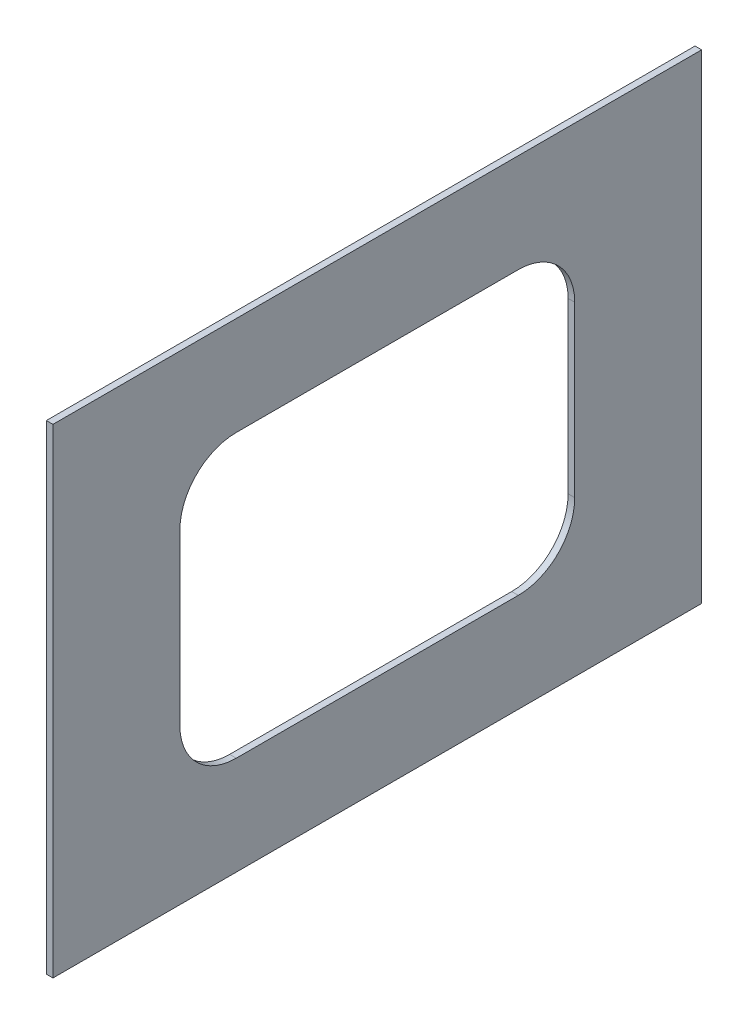
ISO-10303-21;
HEADER;
FILE_DESCRIPTION(('STEP AP214'),'2;1');
FILE_NAME('part.step','',(''),(''),'','','');
FILE_SCHEMA(('AUTOMOTIVE_DESIGN { 1 0 10303 214 1 1 1 1 }'));
ENDSEC;
DATA;
#1=APPLICATION_CONTEXT('core data for automotive mechanical design processes');
#2=APPLICATION_PROTOCOL_DEFINITION('international standard','automotive_design',2000,#1);
#3=PRODUCT_CONTEXT('',#1,'mechanical');
#4=PRODUCT('Part','Part','',(#3));
#5=PRODUCT_RELATED_PRODUCT_CATEGORY('part','',(#4));
#6=PRODUCT_DEFINITION_FORMATION('','',#4);
#7=PRODUCT_DEFINITION_CONTEXT('part definition',#1,'design');
#8=PRODUCT_DEFINITION('design','',#6,#7);
#9=PRODUCT_DEFINITION_SHAPE('','',#8);
#10=(LENGTH_UNIT() NAMED_UNIT(*) SI_UNIT(.MILLI.,.METRE.));
#11=(NAMED_UNIT(*) PLANE_ANGLE_UNIT() SI_UNIT($,.RADIAN.));
#12=(NAMED_UNIT(*) SI_UNIT($,.STERADIAN.) SOLID_ANGLE_UNIT());
#13=UNCERTAINTY_MEASURE_WITH_UNIT(LENGTH_MEASURE(1.E-05),#10,'distance_accuracy_value','');
#14=(GEOMETRIC_REPRESENTATION_CONTEXT(3) GLOBAL_UNCERTAINTY_ASSIGNED_CONTEXT((#13)) GLOBAL_UNIT_ASSIGNED_CONTEXT((#10,
#11,#12)) REPRESENTATION_CONTEXT('',''));
#15=CARTESIAN_POINT('',(0.,0.,0.));
#16=DIRECTION('',(0.,0.,1.));
#17=DIRECTION('',(1.,0.,0.));
#18=AXIS2_PLACEMENT_3D('',#15,#16,#17);
#19=CARTESIAN_POINT('',(11.90625,0.,0.));
#20=DIRECTION('',(-1.,0.,0.));
#21=DIRECTION('',(0.,0.,1.));
#22=AXIS2_PLACEMENT_3D('',#19,#20,#21);
#23=PLANE('',#22);
#24=DIRECTION('',(0.,-1.,0.));
#25=VECTOR('',#24,1.);
#26=CARTESIAN_POINT('',(11.90625,0.,0.));
#27=LINE('',#26,#25);
#28=CARTESIAN_POINT('',(11.90625,863.6,0.));
#29=VERTEX_POINT('',#28);
#30=CARTESIAN_POINT('',(11.90625,0.,0.));
#31=VERTEX_POINT('',#30);
#32=EDGE_CURVE('E218',#29,#31,#27,.T.);
#33=ORIENTED_EDGE('',*,*,#32,.T.);
#34=DIRECTION('',(0.,0.,-1.));
#35=VECTOR('',#34,1.);
#36=CARTESIAN_POINT('',(11.90625,0.,0.));
#37=LINE('',#36,#35);
#38=CARTESIAN_POINT('',(11.90625,0.,-1168.4));
#39=VERTEX_POINT('',#38);
#40=EDGE_CURVE('E222',#31,#39,#37,.T.);
#41=ORIENTED_EDGE('',*,*,#40,.T.);
#42=DIRECTION('',(0.,1.,0.));
#43=VECTOR('',#42,1.);
#44=CARTESIAN_POINT('',(11.90625,0.,-1168.4));
#45=LINE('',#44,#43);
#46=CARTESIAN_POINT('',(11.90625,863.6,-1168.4));
#47=VERTEX_POINT('',#46);
#48=EDGE_CURVE('E226',#39,#47,#45,.T.);
#49=ORIENTED_EDGE('',*,*,#48,.T.);
#50=DIRECTION('',(0.,0.,1.));
#51=VECTOR('',#50,1.);
#52=CARTESIAN_POINT('',(11.90625,863.6,0.));
#53=LINE('',#52,#51);
#54=EDGE_CURVE('E229',#47,#29,#53,.T.);
#55=ORIENTED_EDGE('',*,*,#54,.T.);
#56=EDGE_LOOP('',(#33,#41,#49,#55));
#57=FACE_BOUND('',#56,.T.);
#58=CARTESIAN_POINT('',(11.90625,279.4,-330.2));
#59=DIRECTION('',(1.,0.,0.));
#60=DIRECTION('',(0.,0.,-1.));
#61=AXIS2_PLACEMENT_3D('',#58,#59,#60);
#62=CIRCLE('',#61,101.6);
#63=CARTESIAN_POINT('',(11.90625,279.4,-228.6));
#64=VERTEX_POINT('',#63);
#65=CARTESIAN_POINT('',(11.90625,177.8,-330.2));
#66=VERTEX_POINT('',#65);
#67=EDGE_CURVE('E128',#64,#66,#62,.T.);
#68=ORIENTED_EDGE('',*,*,#67,.F.);
#69=DIRECTION('',(0.,-1.,0.));
#70=VECTOR('',#69,1.);
#71=CARTESIAN_POINT('',(11.90625,584.2,-228.6));
#72=LINE('',#71,#70);
#73=CARTESIAN_POINT('',(11.90625,584.2,-228.6));
#74=VERTEX_POINT('',#73);
#75=EDGE_CURVE('E170',#74,#64,#72,.T.);
#76=ORIENTED_EDGE('',*,*,#75,.F.);
#77=CARTESIAN_POINT('',(11.90625,584.2,-330.2));
#78=DIRECTION('',(1.,0.,0.));
#79=DIRECTION('',(0.,0.,-1.));
#80=AXIS2_PLACEMENT_3D('',#77,#78,#79);
#81=CIRCLE('',#80,101.6);
#82=CARTESIAN_POINT('',(11.90625,685.8,-330.2));
#83=VERTEX_POINT('',#82);
#84=EDGE_CURVE('E167',#83,#74,#81,.T.);
#85=ORIENTED_EDGE('',*,*,#84,.F.);
#86=DIRECTION('',(0.,0.,1.));
#87=VECTOR('',#86,1.);
#88=CARTESIAN_POINT('',(11.90625,685.8,-330.2));
#89=LINE('',#88,#87);
#90=CARTESIAN_POINT('',(11.90625,685.8,-838.2));
#91=VERTEX_POINT('',#90);
#92=EDGE_CURVE('E164',#91,#83,#89,.T.);
#93=ORIENTED_EDGE('',*,*,#92,.F.);
#94=CARTESIAN_POINT('',(11.90625,584.2,-838.2));
#95=DIRECTION('',(1.,0.,0.));
#96=DIRECTION('',(0.,0.,1.));
#97=AXIS2_PLACEMENT_3D('',#94,#95,#96);
#98=CIRCLE('',#97,101.6);
#99=CARTESIAN_POINT('',(11.90625,584.2,-939.8));
#100=VERTEX_POINT('',#99);
#101=EDGE_CURVE('E161',#100,#91,#98,.T.);
#102=ORIENTED_EDGE('',*,*,#101,.F.);
#103=DIRECTION('',(0.,1.,0.));
#104=VECTOR('',#103,1.);
#105=CARTESIAN_POINT('',(11.90625,584.2,-939.8));
#106=LINE('',#105,#104);
#107=CARTESIAN_POINT('',(11.90625,279.4,-939.8));
#108=VERTEX_POINT('',#107);
#109=EDGE_CURVE('E156',#108,#100,#106,.T.);
#110=ORIENTED_EDGE('',*,*,#109,.F.);
#111=CARTESIAN_POINT('',(11.90625,279.4,-838.2));
#112=DIRECTION('',(1.,0.,0.));
#113=DIRECTION('',(0.,0.,-1.));
#114=AXIS2_PLACEMENT_3D('',#111,#112,#113);
#115=CIRCLE('',#114,101.6);
#116=CARTESIAN_POINT('',(11.90625,177.8,-838.2));
#117=VERTEX_POINT('',#116);
#118=EDGE_CURVE('E151',#117,#108,#115,.T.);
#119=ORIENTED_EDGE('',*,*,#118,.F.);
#120=DIRECTION('',(0.,0.,-1.));
#121=VECTOR('',#120,1.);
#122=CARTESIAN_POINT('',(11.90625,177.8,-330.2));
#123=LINE('',#122,#121);
#124=EDGE_CURVE('E137',#66,#117,#123,.T.);
#125=ORIENTED_EDGE('',*,*,#124,.F.);
#126=EDGE_LOOP('',(#68,#76,#85,#93,#102,#110,#119,#125));
#127=FACE_BOUND('',#126,.T.);
#128=ADVANCED_FACE('F38',(#57,#127),#23,.F.);
#129=CARTESIAN_POINT('',(0.,0.,0.));
#130=DIRECTION('',(-1.,0.,0.));
#131=DIRECTION('',(0.,0.,1.));
#132=AXIS2_PLACEMENT_3D('',#129,#130,#131);
#133=PLANE('',#132);
#134=DIRECTION('',(0.,-1.,0.));
#135=VECTOR('',#134,1.);
#136=CARTESIAN_POINT('',(0.,0.,0.));
#137=LINE('',#136,#135);
#138=CARTESIAN_POINT('',(0.,863.6,0.));
#139=VERTEX_POINT('',#138);
#140=CARTESIAN_POINT('',(0.,0.,0.));
#141=VERTEX_POINT('',#140);
#142=EDGE_CURVE('E146',#139,#141,#137,.T.);
#143=ORIENTED_EDGE('',*,*,#142,.F.);
#144=DIRECTION('',(0.,0.,1.));
#145=VECTOR('',#144,1.);
#146=CARTESIAN_POINT('',(0.,863.6,0.));
#147=LINE('',#146,#145);
#148=CARTESIAN_POINT('',(0.,863.6,-1168.4));
#149=VERTEX_POINT('',#148);
#150=EDGE_CURVE('E223',#149,#139,#147,.T.);
#151=ORIENTED_EDGE('',*,*,#150,.F.);
#152=DIRECTION('',(0.,1.,0.));
#153=VECTOR('',#152,1.);
#154=CARTESIAN_POINT('',(0.,0.,-1168.4));
#155=LINE('',#154,#153);
#156=CARTESIAN_POINT('',(0.,0.,-1168.4));
#157=VERTEX_POINT('',#156);
#158=EDGE_CURVE('E239',#157,#149,#155,.T.);
#159=ORIENTED_EDGE('',*,*,#158,.F.);
#160=DIRECTION('',(0.,0.,-1.));
#161=VECTOR('',#160,1.);
#162=CARTESIAN_POINT('',(0.,0.,0.));
#163=LINE('',#162,#161);
#164=EDGE_CURVE('E236',#141,#157,#163,.T.);
#165=ORIENTED_EDGE('',*,*,#164,.F.);
#166=EDGE_LOOP('',(#143,#151,#159,#165));
#167=FACE_BOUND('',#166,.T.);
#168=DIRECTION('',(0.,-1.,0.));
#169=VECTOR('',#168,1.);
#170=CARTESIAN_POINT('',(0.,584.2,-228.6));
#171=LINE('',#170,#169);
#172=CARTESIAN_POINT('',(0.,584.2,-228.6));
#173=VERTEX_POINT('',#172);
#174=CARTESIAN_POINT('',(0.,279.4,-228.6));
#175=VERTEX_POINT('',#174);
#176=EDGE_CURVE('E138',#173,#175,#171,.T.);
#177=ORIENTED_EDGE('',*,*,#176,.T.);
#178=CARTESIAN_POINT('',(0.,279.4,-330.2));
#179=DIRECTION('',(1.,0.,0.));
#180=DIRECTION('',(0.,0.,-1.));
#181=AXIS2_PLACEMENT_3D('',#178,#179,#180);
#182=CIRCLE('',#181,101.6);
#183=CARTESIAN_POINT('',(0.,177.8,-330.2));
#184=VERTEX_POINT('',#183);
#185=EDGE_CURVE('E62',#175,#184,#182,.T.);
#186=ORIENTED_EDGE('',*,*,#185,.T.);
#187=DIRECTION('',(0.,0.,-1.));
#188=VECTOR('',#187,1.);
#189=CARTESIAN_POINT('',(0.,177.8,-330.2));
#190=LINE('',#189,#188);
#191=CARTESIAN_POINT('',(0.,177.8,-838.2));
#192=VERTEX_POINT('',#191);
#193=EDGE_CURVE('E144',#184,#192,#190,.T.);
#194=ORIENTED_EDGE('',*,*,#193,.T.);
#195=CARTESIAN_POINT('',(0.,279.4,-838.2));
#196=DIRECTION('',(1.,0.,0.));
#197=DIRECTION('',(0.,0.,-1.));
#198=AXIS2_PLACEMENT_3D('',#195,#196,#197);
#199=CIRCLE('',#198,101.6);
#200=CARTESIAN_POINT('',(0.,279.4,-939.8));
#201=VERTEX_POINT('',#200);
#202=EDGE_CURVE('E177',#192,#201,#199,.T.);
#203=ORIENTED_EDGE('',*,*,#202,.T.);
#204=DIRECTION('',(0.,1.,0.));
#205=VECTOR('',#204,1.);
#206=CARTESIAN_POINT('',(0.,584.2,-939.8));
#207=LINE('',#206,#205);
#208=CARTESIAN_POINT('',(0.,584.2,-939.8));
#209=VERTEX_POINT('',#208);
#210=EDGE_CURVE('E181',#201,#209,#207,.T.);
#211=ORIENTED_EDGE('',*,*,#210,.T.);
#212=CARTESIAN_POINT('',(0.,584.2,-838.2));
#213=DIRECTION('',(1.,0.,0.));
#214=DIRECTION('',(0.,0.,1.));
#215=AXIS2_PLACEMENT_3D('',#212,#213,#214);
#216=CIRCLE('',#215,101.6);
#217=CARTESIAN_POINT('',(0.,685.8,-838.2));
#218=VERTEX_POINT('',#217);
#219=EDGE_CURVE('E185',#209,#218,#216,.T.);
#220=ORIENTED_EDGE('',*,*,#219,.T.);
#221=DIRECTION('',(0.,0.,1.));
#222=VECTOR('',#221,1.);
#223=CARTESIAN_POINT('',(0.,685.8,-330.2));
#224=LINE('',#223,#222);
#225=CARTESIAN_POINT('',(0.,685.8,-330.2));
#226=VERTEX_POINT('',#225);
#227=EDGE_CURVE('E189',#218,#226,#224,.T.);
#228=ORIENTED_EDGE('',*,*,#227,.T.);
#229=CARTESIAN_POINT('',(0.,584.2,-330.2));
#230=DIRECTION('',(1.,0.,0.));
#231=DIRECTION('',(0.,0.,-1.));
#232=AXIS2_PLACEMENT_3D('',#229,#230,#231);
#233=CIRCLE('',#232,101.6);
#234=EDGE_CURVE('E193',#226,#173,#233,.T.);
#235=ORIENTED_EDGE('',*,*,#234,.T.);
#236=EDGE_LOOP('',(#177,#186,#194,#203,#211,#220,#228,#235));
#237=FACE_BOUND('',#236,.T.);
#238=ADVANCED_FACE('F263',(#167,#237),#133,.T.);
#239=CARTESIAN_POINT('',(11.90625,0.,0.));
#240=DIRECTION('',(0.,0.,-1.));
#241=DIRECTION('',(-1.,0.,0.));
#242=AXIS2_PLACEMENT_3D('',#239,#240,#241);
#243=PLANE('',#242);
#244=ORIENTED_EDGE('',*,*,#142,.T.);
#245=DIRECTION('',(-1.,0.,0.));
#246=VECTOR('',#245,1.);
#247=CARTESIAN_POINT('',(11.90625,0.,0.));
#248=LINE('',#247,#246);
#249=EDGE_CURVE('E11',#31,#141,#248,.T.);
#250=ORIENTED_EDGE('',*,*,#249,.F.);
#251=ORIENTED_EDGE('',*,*,#32,.F.);
#252=DIRECTION('',(-1.,0.,0.));
#253=VECTOR('',#252,1.);
#254=CARTESIAN_POINT('',(11.90625,863.6,0.));
#255=LINE('',#254,#253);
#256=EDGE_CURVE('E232',#29,#139,#255,.T.);
#257=ORIENTED_EDGE('',*,*,#256,.T.);
#258=EDGE_LOOP('',(#244,#250,#251,#257));
#259=FACE_BOUND('',#258,.T.);
#260=ADVANCED_FACE('F40',(#259),#243,.F.);
#261=CARTESIAN_POINT('',(11.90625,0.,0.));
#262=DIRECTION('',(0.,1.,0.));
#263=DIRECTION('',(0.,0.,1.));
#264=AXIS2_PLACEMENT_3D('',#261,#262,#263);
#265=PLANE('',#264);
#266=ORIENTED_EDGE('',*,*,#164,.T.);
#267=DIRECTION('',(-1.,0.,0.));
#268=VECTOR('',#267,1.);
#269=CARTESIAN_POINT('',(11.90625,0.,-1168.4));
#270=LINE('',#269,#268);
#271=EDGE_CURVE('E47',#39,#157,#270,.T.);
#272=ORIENTED_EDGE('',*,*,#271,.F.);
#273=ORIENTED_EDGE('',*,*,#40,.F.);
#274=ORIENTED_EDGE('',*,*,#249,.T.);
#275=EDGE_LOOP('',(#266,#272,#273,#274));
#276=FACE_BOUND('',#275,.T.);
#277=ADVANCED_FACE('F273',(#276),#265,.F.);
#278=CARTESIAN_POINT('',(11.90625,0.,-1168.4));
#279=DIRECTION('',(0.,0.,1.));
#280=DIRECTION('',(1.,0.,0.));
#281=AXIS2_PLACEMENT_3D('',#278,#279,#280);
#282=PLANE('',#281);
#283=ORIENTED_EDGE('',*,*,#158,.T.);
#284=DIRECTION('',(-1.,0.,0.));
#285=VECTOR('',#284,1.);
#286=CARTESIAN_POINT('',(11.90625,863.6,-1168.4));
#287=LINE('',#286,#285);
#288=EDGE_CURVE('E247',#47,#149,#287,.T.);
#289=ORIENTED_EDGE('',*,*,#288,.F.);
#290=ORIENTED_EDGE('',*,*,#48,.F.);
#291=ORIENTED_EDGE('',*,*,#271,.T.);
#292=EDGE_LOOP('',(#283,#289,#290,#291));
#293=FACE_BOUND('',#292,.T.);
#294=ADVANCED_FACE('F257',(#293),#282,.F.);
#295=CARTESIAN_POINT('',(11.90625,863.6,0.));
#296=DIRECTION('',(0.,-1.,0.));
#297=DIRECTION('',(0.,0.,-1.));
#298=AXIS2_PLACEMENT_3D('',#295,#296,#297);
#299=PLANE('',#298);
#300=ORIENTED_EDGE('',*,*,#150,.T.);
#301=ORIENTED_EDGE('',*,*,#256,.F.);
#302=ORIENTED_EDGE('',*,*,#54,.F.);
#303=ORIENTED_EDGE('',*,*,#288,.T.);
#304=EDGE_LOOP('',(#300,#301,#302,#303));
#305=FACE_BOUND('',#304,.T.);
#306=ADVANCED_FACE('F267',(#305),#299,.F.);
#307=CARTESIAN_POINT('',(11.90625,279.4,-330.2));
#308=DIRECTION('',(-1.,0.,0.));
#309=DIRECTION('',(0.,0.,1.));
#310=AXIS2_PLACEMENT_3D('',#307,#308,#309);
#311=CYLINDRICAL_SURFACE('',#310,101.6);
#312=ORIENTED_EDGE('',*,*,#185,.F.);
#313=DIRECTION('',(-1.,0.,0.));
#314=VECTOR('',#313,1.);
#315=CARTESIAN_POINT('',(11.90625,279.4,-228.6));
#316=LINE('',#315,#314);
#317=EDGE_CURVE('E132',#64,#175,#316,.T.);
#318=ORIENTED_EDGE('',*,*,#317,.F.);
#319=ORIENTED_EDGE('',*,*,#67,.T.);
#320=DIRECTION('',(-1.,0.,0.));
#321=VECTOR('',#320,1.);
#322=CARTESIAN_POINT('',(11.90625,177.8,-330.2));
#323=LINE('',#322,#321);
#324=EDGE_CURVE('E131',#66,#184,#323,.T.);
#325=ORIENTED_EDGE('',*,*,#324,.T.);
#326=EDGE_LOOP('',(#312,#318,#319,#325));
#327=FACE_BOUND('',#326,.T.);
#328=ADVANCED_FACE('F130',(#327),#311,.F.);
#329=CARTESIAN_POINT('',(11.90625,177.8,-330.2));
#330=DIRECTION('',(0.,1.,0.));
#331=DIRECTION('',(0.,0.,1.));
#332=AXIS2_PLACEMENT_3D('',#329,#330,#331);
#333=PLANE('',#332);
#334=ORIENTED_EDGE('',*,*,#193,.F.);
#335=ORIENTED_EDGE('',*,*,#324,.F.);
#336=ORIENTED_EDGE('',*,*,#124,.T.);
#337=DIRECTION('',(-1.,0.,0.));
#338=VECTOR('',#337,1.);
#339=CARTESIAN_POINT('',(11.90625,177.8,-838.2));
#340=LINE('',#339,#338);
#341=EDGE_CURVE('E147',#117,#192,#340,.T.);
#342=ORIENTED_EDGE('',*,*,#341,.T.);
#343=EDGE_LOOP('',(#334,#335,#336,#342));
#344=FACE_BOUND('',#343,.T.);
#345=ADVANCED_FACE('F141',(#344),#333,.T.);
#346=CARTESIAN_POINT('',(11.90625,279.4,-838.2));
#347=DIRECTION('',(-1.,0.,0.));
#348=DIRECTION('',(0.,0.,1.));
#349=AXIS2_PLACEMENT_3D('',#346,#347,#348);
#350=CYLINDRICAL_SURFACE('',#349,101.6);
#351=ORIENTED_EDGE('',*,*,#202,.F.);
#352=ORIENTED_EDGE('',*,*,#341,.F.);
#353=ORIENTED_EDGE('',*,*,#118,.T.);
#354=DIRECTION('',(-1.,0.,0.));
#355=VECTOR('',#354,1.);
#356=CARTESIAN_POINT('',(11.90625,279.4,-939.8));
#357=LINE('',#356,#355);
#358=EDGE_CURVE('E213',#108,#201,#357,.T.);
#359=ORIENTED_EDGE('',*,*,#358,.T.);
#360=EDGE_LOOP('',(#351,#352,#353,#359));
#361=FACE_BOUND('',#360,.T.);
#362=ADVANCED_FACE('F296',(#361),#350,.F.);
#363=CARTESIAN_POINT('',(11.90625,584.2,-939.8));
#364=DIRECTION('',(0.,0.,1.));
#365=DIRECTION('',(0.,-1.,0.));
#366=AXIS2_PLACEMENT_3D('',#363,#364,#365);
#367=PLANE('',#366);
#368=ORIENTED_EDGE('',*,*,#210,.F.);
#369=ORIENTED_EDGE('',*,*,#358,.F.);
#370=ORIENTED_EDGE('',*,*,#109,.T.);
#371=DIRECTION('',(-1.,0.,0.));
#372=VECTOR('',#371,1.);
#373=CARTESIAN_POINT('',(11.90625,584.2,-939.8));
#374=LINE('',#373,#372);
#375=EDGE_CURVE('E210',#100,#209,#374,.T.);
#376=ORIENTED_EDGE('',*,*,#375,.T.);
#377=EDGE_LOOP('',(#368,#369,#370,#376));
#378=FACE_BOUND('',#377,.T.);
#379=ADVANCED_FACE('F300',(#378),#367,.T.);
#380=CARTESIAN_POINT('',(11.90625,584.2,-838.2));
#381=DIRECTION('',(-1.,0.,0.));
#382=DIRECTION('',(0.,0.,1.));
#383=AXIS2_PLACEMENT_3D('',#380,#381,#382);
#384=CYLINDRICAL_SURFACE('',#383,101.6);
#385=ORIENTED_EDGE('',*,*,#219,.F.);
#386=ORIENTED_EDGE('',*,*,#375,.F.);
#387=ORIENTED_EDGE('',*,*,#101,.T.);
#388=DIRECTION('',(-1.,0.,0.));
#389=VECTOR('',#388,1.);
#390=CARTESIAN_POINT('',(11.90625,685.8,-838.2));
#391=LINE('',#390,#389);
#392=EDGE_CURVE('E207',#91,#218,#391,.T.);
#393=ORIENTED_EDGE('',*,*,#392,.T.);
#394=EDGE_LOOP('',(#385,#386,#387,#393));
#395=FACE_BOUND('',#394,.T.);
#396=ADVANCED_FACE('F306',(#395),#384,.F.);
#397=CARTESIAN_POINT('',(11.90625,685.8,-330.2));
#398=DIRECTION('',(0.,-1.,0.));
#399=DIRECTION('',(0.,0.,-1.));
#400=AXIS2_PLACEMENT_3D('',#397,#398,#399);
#401=PLANE('',#400);
#402=ORIENTED_EDGE('',*,*,#227,.F.);
#403=ORIENTED_EDGE('',*,*,#392,.F.);
#404=ORIENTED_EDGE('',*,*,#92,.T.);
#405=DIRECTION('',(-1.,0.,0.));
#406=VECTOR('',#405,1.);
#407=CARTESIAN_POINT('',(11.90625,685.8,-330.2));
#408=LINE('',#407,#406);
#409=EDGE_CURVE('E204',#83,#226,#408,.T.);
#410=ORIENTED_EDGE('',*,*,#409,.T.);
#411=EDGE_LOOP('',(#402,#403,#404,#410));
#412=FACE_BOUND('',#411,.T.);
#413=ADVANCED_FACE('F310',(#412),#401,.T.);
#414=CARTESIAN_POINT('',(11.90625,584.2,-330.2));
#415=DIRECTION('',(-1.,0.,0.));
#416=DIRECTION('',(0.,0.,1.));
#417=AXIS2_PLACEMENT_3D('',#414,#415,#416);
#418=CYLINDRICAL_SURFACE('',#417,101.6);
#419=ORIENTED_EDGE('',*,*,#234,.F.);
#420=ORIENTED_EDGE('',*,*,#409,.F.);
#421=ORIENTED_EDGE('',*,*,#84,.T.);
#422=DIRECTION('',(-1.,0.,0.));
#423=VECTOR('',#422,1.);
#424=CARTESIAN_POINT('',(11.90625,584.2,-228.6));
#425=LINE('',#424,#423);
#426=EDGE_CURVE('E54',#74,#173,#425,.T.);
#427=ORIENTED_EDGE('',*,*,#426,.T.);
#428=EDGE_LOOP('',(#419,#420,#421,#427));
#429=FACE_BOUND('',#428,.T.);
#430=ADVANCED_FACE('F314',(#429),#418,.F.);
#431=CARTESIAN_POINT('',(11.90625,584.2,-228.6));
#432=DIRECTION('',(0.,0.,-1.));
#433=DIRECTION('',(-1.,0.,0.));
#434=AXIS2_PLACEMENT_3D('',#431,#432,#433);
#435=PLANE('',#434);
#436=ORIENTED_EDGE('',*,*,#176,.F.);
#437=ORIENTED_EDGE('',*,*,#426,.F.);
#438=ORIENTED_EDGE('',*,*,#75,.T.);
#439=ORIENTED_EDGE('',*,*,#317,.T.);
#440=EDGE_LOOP('',(#436,#437,#438,#439));
#441=FACE_BOUND('',#440,.T.);
#442=ADVANCED_FACE('F318',(#441),#435,.T.);
#443=CLOSED_SHELL('',(#128,#238,#260,#277,#294,#306,#328,#345,#362,#379,#396,#413,#430,#442));
#444=MANIFOLD_SOLID_BREP('B2',#443);
#445=ADVANCED_BREP_SHAPE_REPRESENTATION('',(#18,#444),#14);
#446=SHAPE_DEFINITION_REPRESENTATION(#9,#445);
ENDSEC;
END-ISO-10303-21;
